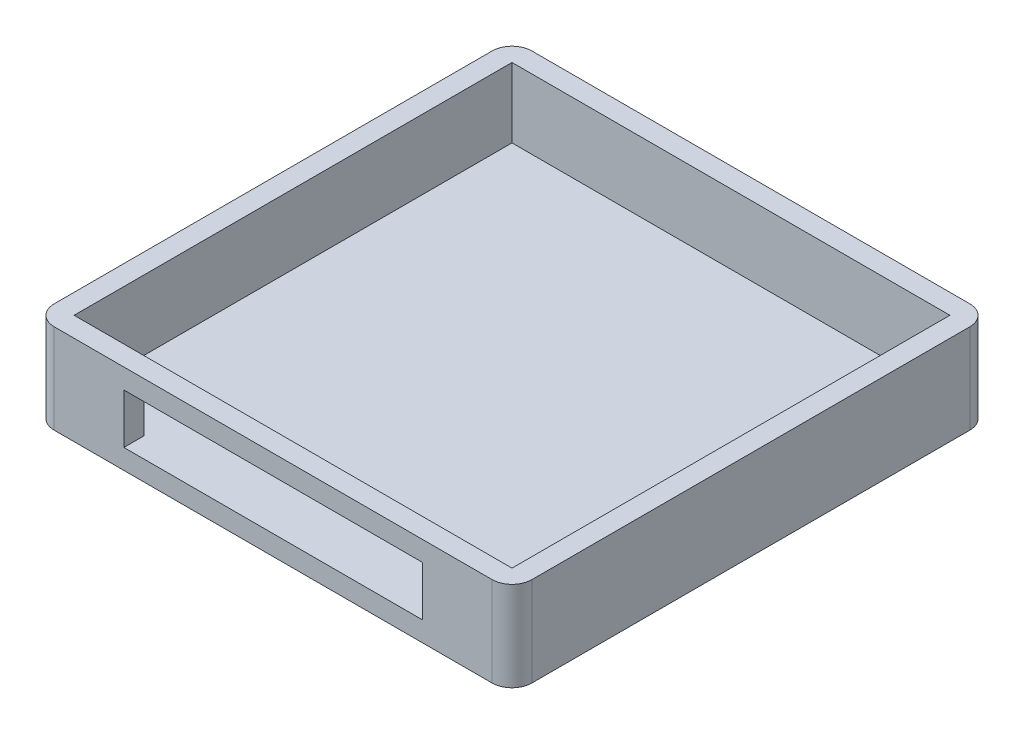
ISO-10303-21;
HEADER;
FILE_DESCRIPTION(('STEP AP214'),'2;1');
FILE_NAME('part.step','',(''),(''),'','','');
FILE_SCHEMA(('AUTOMOTIVE_DESIGN { 1 0 10303 214 1 1 1 1 }'));
ENDSEC;
DATA;
#1=APPLICATION_CONTEXT('core data for automotive mechanical design processes');
#2=APPLICATION_PROTOCOL_DEFINITION('international standard','automotive_design',2000,#1);
#3=PRODUCT_CONTEXT('',#1,'mechanical');
#4=PRODUCT('Part','Part','',(#3));
#5=PRODUCT_RELATED_PRODUCT_CATEGORY('part','',(#4));
#6=PRODUCT_DEFINITION_FORMATION('','',#4);
#7=PRODUCT_DEFINITION_CONTEXT('part definition',#1,'design');
#8=PRODUCT_DEFINITION('design','',#6,#7);
#9=PRODUCT_DEFINITION_SHAPE('','',#8);
#10=(LENGTH_UNIT() NAMED_UNIT(*) SI_UNIT(.MILLI.,.METRE.));
#11=(NAMED_UNIT(*) PLANE_ANGLE_UNIT() SI_UNIT($,.RADIAN.));
#12=(NAMED_UNIT(*) SI_UNIT($,.STERADIAN.) SOLID_ANGLE_UNIT());
#13=UNCERTAINTY_MEASURE_WITH_UNIT(LENGTH_MEASURE(1.E-05),#10,'distance_accuracy_value','');
#14=(GEOMETRIC_REPRESENTATION_CONTEXT(3) GLOBAL_UNCERTAINTY_ASSIGNED_CONTEXT((#13)) GLOBAL_UNIT_ASSIGNED_CONTEXT((#10,
#11,#12)) REPRESENTATION_CONTEXT('',''));
#15=CARTESIAN_POINT('',(0.,0.,0.));
#16=DIRECTION('',(0.,0.,1.));
#17=DIRECTION('',(1.,0.,0.));
#18=AXIS2_PLACEMENT_3D('',#15,#16,#17);
#19=CARTESIAN_POINT('',(24.,9.,-24.));
#20=DIRECTION('',(-1.,0.,0.));
#21=DIRECTION('',(0.,0.,1.));
#22=AXIS2_PLACEMENT_3D('',#19,#20,#21);
#23=PLANE('',#22);
#24=DIRECTION('',(0.,0.,-1.));
#25=VECTOR('',#24,1.);
#26=CARTESIAN_POINT('',(24.,0.,-24.));
#27=LINE('',#26,#25);
#28=CARTESIAN_POINT('',(24.,0.,22.));
#29=VERTEX_POINT('',#28);
#30=CARTESIAN_POINT('',(24.,0.,-22.));
#31=VERTEX_POINT('',#30);
#32=EDGE_CURVE('E225',#29,#31,#27,.T.);
#33=ORIENTED_EDGE('',*,*,#32,.T.);
#34=DIRECTION('',(0.,-1.,0.));
#35=VECTOR('',#34,1.);
#36=CARTESIAN_POINT('',(24.,9.,-22.));
#37=LINE('',#36,#35);
#38=CARTESIAN_POINT('',(24.,9.,-22.));
#39=VERTEX_POINT('',#38);
#40=EDGE_CURVE('E280',#31,#39,#37,.F.);
#41=ORIENTED_EDGE('',*,*,#40,.T.);
#42=DIRECTION('',(0.,0.,-1.));
#43=VECTOR('',#42,1.);
#44=CARTESIAN_POINT('',(24.,9.,-24.));
#45=LINE('',#44,#43);
#46=CARTESIAN_POINT('',(24.,9.,22.));
#47=VERTEX_POINT('',#46);
#48=EDGE_CURVE('E232',#47,#39,#45,.T.);
#49=ORIENTED_EDGE('',*,*,#48,.F.);
#50=DIRECTION('',(0.,-1.,0.));
#51=VECTOR('',#50,1.);
#52=CARTESIAN_POINT('',(24.,9.,22.));
#53=LINE('',#52,#51);
#54=EDGE_CURVE('E277',#47,#29,#53,.T.);
#55=ORIENTED_EDGE('',*,*,#54,.T.);
#56=EDGE_LOOP('',(#33,#41,#49,#55));
#57=FACE_BOUND('',#56,.T.);
#58=ADVANCED_FACE('F33',(#57),#23,.F.);
#59=CARTESIAN_POINT('',(-24.,9.,-24.));
#60=DIRECTION('',(0.,0.,1.));
#61=DIRECTION('',(1.,0.,0.));
#62=AXIS2_PLACEMENT_3D('',#59,#60,#61);
#63=PLANE('',#62);
#64=DIRECTION('',(-1.,0.,0.));
#65=VECTOR('',#64,1.);
#66=CARTESIAN_POINT('',(-24.,0.,-24.));
#67=LINE('',#66,#65);
#68=CARTESIAN_POINT('',(22.,0.,-24.));
#69=VERTEX_POINT('',#68);
#70=CARTESIAN_POINT('',(-22.,0.,-24.));
#71=VERTEX_POINT('',#70);
#72=EDGE_CURVE('E244',#69,#71,#67,.T.);
#73=ORIENTED_EDGE('',*,*,#72,.T.);
#74=DIRECTION('',(0.,-1.,0.));
#75=VECTOR('',#74,1.);
#76=CARTESIAN_POINT('',(-22.,9.,-24.));
#77=LINE('',#76,#75);
#78=CARTESIAN_POINT('',(-22.,9.,-24.));
#79=VERTEX_POINT('',#78);
#80=EDGE_CURVE('E268',#71,#79,#77,.F.);
#81=ORIENTED_EDGE('',*,*,#80,.T.);
#82=DIRECTION('',(-1.,0.,0.));
#83=VECTOR('',#82,1.);
#84=CARTESIAN_POINT('',(-24.,9.,-24.));
#85=LINE('',#84,#83);
#86=CARTESIAN_POINT('',(22.,9.,-24.));
#87=VERTEX_POINT('',#86);
#88=EDGE_CURVE('E235',#87,#79,#85,.T.);
#89=ORIENTED_EDGE('',*,*,#88,.F.);
#90=DIRECTION('',(0.,-1.,0.));
#91=VECTOR('',#90,1.);
#92=CARTESIAN_POINT('',(22.,9.,-24.));
#93=LINE('',#92,#91);
#94=EDGE_CURVE('E265',#87,#69,#93,.T.);
#95=ORIENTED_EDGE('',*,*,#94,.T.);
#96=EDGE_LOOP('',(#73,#81,#89,#95));
#97=FACE_BOUND('',#96,.T.);
#98=ADVANCED_FACE('F295',(#97),#63,.F.);
#99=CARTESIAN_POINT('',(-24.,9.,-24.));
#100=DIRECTION('',(1.,0.,0.));
#101=DIRECTION('',(0.,0.,-1.));
#102=AXIS2_PLACEMENT_3D('',#99,#100,#101);
#103=PLANE('',#102);
#104=DIRECTION('',(0.,0.,1.));
#105=VECTOR('',#104,1.);
#106=CARTESIAN_POINT('',(-24.,9.,-24.));
#107=LINE('',#106,#105);
#108=CARTESIAN_POINT('',(-24.,9.,-22.));
#109=VERTEX_POINT('',#108);
#110=CARTESIAN_POINT('',(-24.,9.,22.));
#111=VERTEX_POINT('',#110);
#112=EDGE_CURVE('E239',#109,#111,#107,.T.);
#113=ORIENTED_EDGE('',*,*,#112,.F.);
#114=DIRECTION('',(0.,-1.,0.));
#115=VECTOR('',#114,1.);
#116=CARTESIAN_POINT('',(-24.,9.,-22.));
#117=LINE('',#116,#115);
#118=CARTESIAN_POINT('',(-24.,0.,-22.));
#119=VERTEX_POINT('',#118);
#120=EDGE_CURVE('E254',#109,#119,#117,.T.);
#121=ORIENTED_EDGE('',*,*,#120,.T.);
#122=DIRECTION('',(0.,0.,1.));
#123=VECTOR('',#122,1.);
#124=CARTESIAN_POINT('',(-24.,0.,-24.));
#125=LINE('',#124,#123);
#126=CARTESIAN_POINT('',(-24.,0.,22.));
#127=VERTEX_POINT('',#126);
#128=EDGE_CURVE('E247',#119,#127,#125,.T.);
#129=ORIENTED_EDGE('',*,*,#128,.T.);
#130=DIRECTION('',(0.,-1.,0.));
#131=VECTOR('',#130,1.);
#132=CARTESIAN_POINT('',(-24.,9.,22.));
#133=LINE('',#132,#131);
#134=EDGE_CURVE('E252',#127,#111,#133,.F.);
#135=ORIENTED_EDGE('',*,*,#134,.T.);
#136=EDGE_LOOP('',(#113,#121,#129,#135));
#137=FACE_BOUND('',#136,.T.);
#138=ADVANCED_FACE('F306',(#137),#103,.F.);
#139=CARTESIAN_POINT('',(-24.,9.,24.));
#140=DIRECTION('',(0.,0.,-1.));
#141=DIRECTION('',(-1.,0.,0.));
#142=AXIS2_PLACEMENT_3D('',#139,#140,#141);
#143=PLANE('',#142);
#144=DIRECTION('',(-1.,0.,0.));
#145=VECTOR('',#144,1.);
#146=CARTESIAN_POINT('',(-15.,7.,24.));
#147=LINE('',#146,#145);
#148=CARTESIAN_POINT('',(15.,7.,24.));
#149=VERTEX_POINT('',#148);
#150=CARTESIAN_POINT('',(-15.,7.,24.));
#151=VERTEX_POINT('',#150);
#152=EDGE_CURVE('E162',#149,#151,#147,.T.);
#153=ORIENTED_EDGE('',*,*,#152,.F.);
#154=DIRECTION('',(0.,1.,0.));
#155=VECTOR('',#154,1.);
#156=CARTESIAN_POINT('',(15.,7.,24.));
#157=LINE('',#156,#155);
#158=CARTESIAN_POINT('',(15.,2.,24.));
#159=VERTEX_POINT('',#158);
#160=EDGE_CURVE('E167',#159,#149,#157,.T.);
#161=ORIENTED_EDGE('',*,*,#160,.F.);
#162=DIRECTION('',(1.,0.,0.));
#163=VECTOR('',#162,1.);
#164=CARTESIAN_POINT('',(-15.,2.,24.));
#165=LINE('',#164,#163);
#166=CARTESIAN_POINT('',(-15.,2.,24.));
#167=VERTEX_POINT('',#166);
#168=EDGE_CURVE('E171',#167,#159,#165,.T.);
#169=ORIENTED_EDGE('',*,*,#168,.F.);
#170=DIRECTION('',(0.,-1.,0.));
#171=VECTOR('',#170,1.);
#172=CARTESIAN_POINT('',(-15.,7.,24.));
#173=LINE('',#172,#171);
#174=EDGE_CURVE('E151',#151,#167,#173,.T.);
#175=ORIENTED_EDGE('',*,*,#174,.F.);
#176=EDGE_LOOP('',(#153,#161,#169,#175));
#177=FACE_BOUND('',#176,.T.);
#178=DIRECTION('',(1.,0.,0.));
#179=VECTOR('',#178,1.);
#180=CARTESIAN_POINT('',(-24.,9.,24.));
#181=LINE('',#180,#179);
#182=CARTESIAN_POINT('',(-22.,9.,24.));
#183=VERTEX_POINT('',#182);
#184=CARTESIAN_POINT('',(22.,9.,24.));
#185=VERTEX_POINT('',#184);
#186=EDGE_CURVE('E198',#183,#185,#181,.T.);
#187=ORIENTED_EDGE('',*,*,#186,.F.);
#188=DIRECTION('',(0.,-1.,0.));
#189=VECTOR('',#188,1.);
#190=CARTESIAN_POINT('',(-22.,9.,24.));
#191=LINE('',#190,#189);
#192=CARTESIAN_POINT('',(-22.,0.,24.));
#193=VERTEX_POINT('',#192);
#194=EDGE_CURVE('E11',#183,#193,#191,.T.);
#195=ORIENTED_EDGE('',*,*,#194,.T.);
#196=DIRECTION('',(1.,0.,0.));
#197=VECTOR('',#196,1.);
#198=CARTESIAN_POINT('',(-24.,0.,24.));
#199=LINE('',#198,#197);
#200=CARTESIAN_POINT('',(22.,0.,24.));
#201=VERTEX_POINT('',#200);
#202=EDGE_CURVE('E236',#193,#201,#199,.T.);
#203=ORIENTED_EDGE('',*,*,#202,.T.);
#204=DIRECTION('',(0.,-1.,0.));
#205=VECTOR('',#204,1.);
#206=CARTESIAN_POINT('',(22.,9.,24.));
#207=LINE('',#206,#205);
#208=EDGE_CURVE('E41',#201,#185,#207,.F.);
#209=ORIENTED_EDGE('',*,*,#208,.T.);
#210=EDGE_LOOP('',(#187,#195,#203,#209));
#211=FACE_BOUND('',#210,.T.);
#212=ADVANCED_FACE('F169',(#177,#211),#143,.F.);
#213=CARTESIAN_POINT('',(0.,9.,0.));
#214=DIRECTION('',(0.,1.,0.));
#215=DIRECTION('',(0.,0.,1.));
#216=AXIS2_PLACEMENT_3D('',#213,#214,#215);
#217=PLANE('',#216);
#218=DIRECTION('',(0.,0.,-1.));
#219=VECTOR('',#218,1.);
#220=CARTESIAN_POINT('',(22.,9.,-22.));
#221=LINE('',#220,#219);
#222=CARTESIAN_POINT('',(22.,9.,22.));
#223=VERTEX_POINT('',#222);
#224=CARTESIAN_POINT('',(22.,9.,-22.));
#225=VERTEX_POINT('',#224);
#226=EDGE_CURVE('E193',#223,#225,#221,.T.);
#227=ORIENTED_EDGE('',*,*,#226,.F.);
#228=DIRECTION('',(1.,0.,0.));
#229=VECTOR('',#228,1.);
#230=CARTESIAN_POINT('',(-22.,9.,22.));
#231=LINE('',#230,#229);
#232=CARTESIAN_POINT('',(-22.,9.,22.));
#233=VERTEX_POINT('',#232);
#234=EDGE_CURVE('E203',#233,#223,#231,.T.);
#235=ORIENTED_EDGE('',*,*,#234,.F.);
#236=DIRECTION('',(0.,0.,1.));
#237=VECTOR('',#236,1.);
#238=CARTESIAN_POINT('',(-22.,9.,-22.));
#239=LINE('',#238,#237);
#240=CARTESIAN_POINT('',(-22.,9.,-22.));
#241=VERTEX_POINT('',#240);
#242=EDGE_CURVE('E218',#241,#233,#239,.T.);
#243=ORIENTED_EDGE('',*,*,#242,.F.);
#244=DIRECTION('',(-1.,0.,0.));
#245=VECTOR('',#244,1.);
#246=CARTESIAN_POINT('',(-22.,9.,-22.));
#247=LINE('',#246,#245);
#248=EDGE_CURVE('E215',#225,#241,#247,.T.);
#249=ORIENTED_EDGE('',*,*,#248,.F.);
#250=EDGE_LOOP('',(#227,#235,#243,#249));
#251=FACE_BOUND('',#250,.T.);
#252=ORIENTED_EDGE('',*,*,#88,.T.);
#253=CARTESIAN_POINT('',(-22.,9.,-22.));
#254=DIRECTION('',(0.,1.,0.));
#255=DIRECTION('',(0.,0.,1.));
#256=AXIS2_PLACEMENT_3D('',#253,#254,#255);
#257=CIRCLE('',#256,2.);
#258=EDGE_CURVE('E275',#79,#109,#257,.T.);
#259=ORIENTED_EDGE('',*,*,#258,.T.);
#260=ORIENTED_EDGE('',*,*,#112,.T.);
#261=CARTESIAN_POINT('',(-22.,9.,22.));
#262=DIRECTION('',(0.,1.,0.));
#263=DIRECTION('',(0.,0.,1.));
#264=AXIS2_PLACEMENT_3D('',#261,#262,#263);
#265=CIRCLE('',#264,2.);
#266=EDGE_CURVE('E54',#111,#183,#265,.T.);
#267=ORIENTED_EDGE('',*,*,#266,.T.);
#268=ORIENTED_EDGE('',*,*,#186,.T.);
#269=CARTESIAN_POINT('',(22.,9.,22.));
#270=DIRECTION('',(0.,1.,0.));
#271=DIRECTION('',(0.,0.,1.));
#272=AXIS2_PLACEMENT_3D('',#269,#270,#271);
#273=CIRCLE('',#272,2.);
#274=EDGE_CURVE('E270',#185,#47,#273,.T.);
#275=ORIENTED_EDGE('',*,*,#274,.T.);
#276=ORIENTED_EDGE('',*,*,#48,.T.);
#277=CARTESIAN_POINT('',(22.,9.,-22.));
#278=DIRECTION('',(0.,1.,0.));
#279=DIRECTION('',(0.,0.,1.));
#280=AXIS2_PLACEMENT_3D('',#277,#278,#279);
#281=CIRCLE('',#280,2.);
#282=EDGE_CURVE('E273',#39,#87,#281,.T.);
#283=ORIENTED_EDGE('',*,*,#282,.T.);
#284=EDGE_LOOP('',(#252,#259,#260,#267,#268,#275,#276,#283));
#285=FACE_BOUND('',#284,.T.);
#286=ADVANCED_FACE('F288',(#251,#285),#217,.T.);
#287=CARTESIAN_POINT('',(0.,0.,0.));
#288=DIRECTION('',(0.,1.,0.));
#289=DIRECTION('',(0.,0.,1.));
#290=AXIS2_PLACEMENT_3D('',#287,#288,#289);
#291=PLANE('',#290);
#292=CARTESIAN_POINT('',(0.,0.,0.));
#293=DIRECTION('',(0.,-1.,0.));
#294=DIRECTION('',(0.,0.,-1.));
#295=AXIS2_PLACEMENT_3D('',#292,#293,#294);
#296=CIRCLE('',#295,6.);
#297=CARTESIAN_POINT('',(0.,0.,-6.));
#298=VERTEX_POINT('',#297);
#299=EDGE_CURVE('E194',#298,#298,#296,.T.);
#300=ORIENTED_EDGE('',*,*,#299,.F.);
#301=EDGE_LOOP('',(#300));
#302=FACE_BOUND('',#301,.T.);
#303=ORIENTED_EDGE('',*,*,#128,.F.);
#304=CARTESIAN_POINT('',(-22.,0.,-22.));
#305=DIRECTION('',(0.,1.,0.));
#306=DIRECTION('',(0.,0.,1.));
#307=AXIS2_PLACEMENT_3D('',#304,#305,#306);
#308=CIRCLE('',#307,2.);
#309=EDGE_CURVE('E263',#119,#71,#308,.F.);
#310=ORIENTED_EDGE('',*,*,#309,.T.);
#311=ORIENTED_EDGE('',*,*,#72,.F.);
#312=CARTESIAN_POINT('',(22.,0.,-22.));
#313=DIRECTION('',(0.,1.,0.));
#314=DIRECTION('',(0.,0.,1.));
#315=AXIS2_PLACEMENT_3D('',#312,#313,#314);
#316=CIRCLE('',#315,2.);
#317=EDGE_CURVE('E261',#69,#31,#316,.F.);
#318=ORIENTED_EDGE('',*,*,#317,.T.);
#319=ORIENTED_EDGE('',*,*,#32,.F.);
#320=CARTESIAN_POINT('',(22.,0.,22.));
#321=DIRECTION('',(0.,1.,0.));
#322=DIRECTION('',(0.,0.,1.));
#323=AXIS2_PLACEMENT_3D('',#320,#321,#322);
#324=CIRCLE('',#323,2.);
#325=EDGE_CURVE('E257',#29,#201,#324,.F.);
#326=ORIENTED_EDGE('',*,*,#325,.T.);
#327=ORIENTED_EDGE('',*,*,#202,.F.);
#328=CARTESIAN_POINT('',(-22.,0.,22.));
#329=DIRECTION('',(0.,1.,0.));
#330=DIRECTION('',(0.,0.,1.));
#331=AXIS2_PLACEMENT_3D('',#328,#329,#330);
#332=CIRCLE('',#331,2.);
#333=EDGE_CURVE('E259',#193,#127,#332,.F.);
#334=ORIENTED_EDGE('',*,*,#333,.T.);
#335=EDGE_LOOP('',(#303,#310,#311,#318,#319,#326,#327,#334));
#336=FACE_BOUND('',#335,.T.);
#337=ADVANCED_FACE('F299',(#302,#336),#291,.F.);
#338=CARTESIAN_POINT('',(22.,2.,-22.));
#339=DIRECTION('',(1.,0.,0.));
#340=DIRECTION('',(0.,0.,-1.));
#341=AXIS2_PLACEMENT_3D('',#338,#339,#340);
#342=PLANE('',#341);
#343=ORIENTED_EDGE('',*,*,#226,.T.);
#344=DIRECTION('',(0.,1.,0.));
#345=VECTOR('',#344,1.);
#346=CARTESIAN_POINT('',(22.,2.,-22.));
#347=LINE('',#346,#345);
#348=CARTESIAN_POINT('',(22.,2.,-22.));
#349=VERTEX_POINT('',#348);
#350=EDGE_CURVE('E213',#349,#225,#347,.T.);
#351=ORIENTED_EDGE('',*,*,#350,.F.);
#352=DIRECTION('',(0.,0.,-1.));
#353=VECTOR('',#352,1.);
#354=CARTESIAN_POINT('',(22.,2.,-22.));
#355=LINE('',#354,#353);
#356=CARTESIAN_POINT('',(22.,2.,22.));
#357=VERTEX_POINT('',#356);
#358=EDGE_CURVE('E199',#357,#349,#355,.T.);
#359=ORIENTED_EDGE('',*,*,#358,.F.);
#360=DIRECTION('',(0.,1.,0.));
#361=VECTOR('',#360,1.);
#362=CARTESIAN_POINT('',(22.,2.,22.));
#363=LINE('',#362,#361);
#364=EDGE_CURVE('E223',#357,#223,#363,.T.);
#365=ORIENTED_EDGE('',*,*,#364,.T.);
#366=EDGE_LOOP('',(#343,#351,#359,#365));
#367=FACE_BOUND('',#366,.T.);
#368=ADVANCED_FACE('F448',(#367),#342,.F.);
#369=CARTESIAN_POINT('',(-22.,2.,22.));
#370=DIRECTION('',(0.,0.,1.));
#371=DIRECTION('',(1.,0.,0.));
#372=AXIS2_PLACEMENT_3D('',#369,#370,#371);
#373=PLANE('',#372);
#374=DIRECTION('',(1.,0.,0.));
#375=VECTOR('',#374,1.);
#376=CARTESIAN_POINT('',(-22.,2.,22.));
#377=LINE('',#376,#375);
#378=CARTESIAN_POINT('',(15.,2.,22.));
#379=VERTEX_POINT('',#378);
#380=EDGE_CURVE('E209',#379,#357,#377,.T.);
#381=ORIENTED_EDGE('',*,*,#380,.F.);
#382=DIRECTION('',(0.,1.,0.));
#383=VECTOR('',#382,1.);
#384=CARTESIAN_POINT('',(15.,2.,22.));
#385=LINE('',#384,#383);
#386=CARTESIAN_POINT('',(15.,7.,22.));
#387=VERTEX_POINT('',#386);
#388=EDGE_CURVE('E181',#379,#387,#385,.T.);
#389=ORIENTED_EDGE('',*,*,#388,.T.);
#390=DIRECTION('',(-1.,0.,0.));
#391=VECTOR('',#390,1.);
#392=CARTESIAN_POINT('',(-22.,7.,22.));
#393=LINE('',#392,#391);
#394=CARTESIAN_POINT('',(-15.,7.,22.));
#395=VERTEX_POINT('',#394);
#396=EDGE_CURVE('E197',#387,#395,#393,.T.);
#397=ORIENTED_EDGE('',*,*,#396,.T.);
#398=DIRECTION('',(0.,-1.,0.));
#399=VECTOR('',#398,1.);
#400=CARTESIAN_POINT('',(-15.,2.,22.));
#401=LINE('',#400,#399);
#402=CARTESIAN_POINT('',(-15.,2.,22.));
#403=VERTEX_POINT('',#402);
#404=EDGE_CURVE('E154',#395,#403,#401,.T.);
#405=ORIENTED_EDGE('',*,*,#404,.T.);
#406=CARTESIAN_POINT('',(-22.,2.,22.));
#407=VERTEX_POINT('',#406);
#408=EDGE_CURVE('E210',#407,#403,#377,.T.);
#409=ORIENTED_EDGE('',*,*,#408,.F.);
#410=DIRECTION('',(0.,1.,0.));
#411=VECTOR('',#410,1.);
#412=CARTESIAN_POINT('',(-22.,2.,22.));
#413=LINE('',#412,#411);
#414=EDGE_CURVE('E226',#407,#233,#413,.T.);
#415=ORIENTED_EDGE('',*,*,#414,.T.);
#416=ORIENTED_EDGE('',*,*,#234,.T.);
#417=ORIENTED_EDGE('',*,*,#364,.F.);
#418=EDGE_LOOP('',(#381,#389,#397,#405,#409,#415,#416,#417));
#419=FACE_BOUND('',#418,.T.);
#420=ADVANCED_FACE('F440',(#419),#373,.F.);
#421=CARTESIAN_POINT('',(-22.,2.,-22.));
#422=DIRECTION('',(-1.,0.,0.));
#423=DIRECTION('',(0.,0.,1.));
#424=AXIS2_PLACEMENT_3D('',#421,#422,#423);
#425=PLANE('',#424);
#426=ORIENTED_EDGE('',*,*,#242,.T.);
#427=ORIENTED_EDGE('',*,*,#414,.F.);
#428=DIRECTION('',(0.,0.,1.));
#429=VECTOR('',#428,1.);
#430=CARTESIAN_POINT('',(-22.,2.,-22.));
#431=LINE('',#430,#429);
#432=CARTESIAN_POINT('',(-22.,2.,-22.));
#433=VERTEX_POINT('',#432);
#434=EDGE_CURVE('E206',#433,#407,#431,.T.);
#435=ORIENTED_EDGE('',*,*,#434,.F.);
#436=DIRECTION('',(0.,1.,0.));
#437=VECTOR('',#436,1.);
#438=CARTESIAN_POINT('',(-22.,2.,-22.));
#439=LINE('',#438,#437);
#440=EDGE_CURVE('E228',#433,#241,#439,.T.);
#441=ORIENTED_EDGE('',*,*,#440,.T.);
#442=EDGE_LOOP('',(#426,#427,#435,#441));
#443=FACE_BOUND('',#442,.T.);
#444=ADVANCED_FACE('F430',(#443),#425,.F.);
#445=CARTESIAN_POINT('',(-22.,2.,-22.));
#446=DIRECTION('',(0.,0.,-1.));
#447=DIRECTION('',(-1.,0.,0.));
#448=AXIS2_PLACEMENT_3D('',#445,#446,#447);
#449=PLANE('',#448);
#450=ORIENTED_EDGE('',*,*,#248,.T.);
#451=ORIENTED_EDGE('',*,*,#440,.F.);
#452=DIRECTION('',(-1.,0.,0.));
#453=VECTOR('',#452,1.);
#454=CARTESIAN_POINT('',(-22.,2.,-22.));
#455=LINE('',#454,#453);
#456=EDGE_CURVE('E202',#349,#433,#455,.T.);
#457=ORIENTED_EDGE('',*,*,#456,.F.);
#458=ORIENTED_EDGE('',*,*,#350,.T.);
#459=EDGE_LOOP('',(#450,#451,#457,#458));
#460=FACE_BOUND('',#459,.T.);
#461=ADVANCED_FACE('F384',(#460),#449,.F.);
#462=CARTESIAN_POINT('',(0.,2.,0.));
#463=DIRECTION('',(0.,1.,0.));
#464=DIRECTION('',(0.,0.,1.));
#465=AXIS2_PLACEMENT_3D('',#462,#463,#464);
#466=PLANE('',#465);
#467=ORIENTED_EDGE('',*,*,#408,.T.);
#468=DIRECTION('',(0.,0.,1.));
#469=VECTOR('',#468,1.);
#470=CARTESIAN_POINT('',(-15.,2.,14.));
#471=LINE('',#470,#469);
#472=EDGE_CURVE('E157',#403,#167,#471,.T.);
#473=ORIENTED_EDGE('',*,*,#472,.T.);
#474=ORIENTED_EDGE('',*,*,#168,.T.);
#475=DIRECTION('',(0.,0.,1.));
#476=VECTOR('',#475,1.);
#477=CARTESIAN_POINT('',(15.,2.,14.));
#478=LINE('',#477,#476);
#479=EDGE_CURVE('E176',#379,#159,#478,.T.);
#480=ORIENTED_EDGE('',*,*,#479,.F.);
#481=ORIENTED_EDGE('',*,*,#380,.T.);
#482=ORIENTED_EDGE('',*,*,#358,.T.);
#483=ORIENTED_EDGE('',*,*,#456,.T.);
#484=ORIENTED_EDGE('',*,*,#434,.T.);
#485=EDGE_LOOP('',(#467,#473,#474,#480,#481,#482,#483,#484));
#486=FACE_BOUND('',#485,.T.);
#487=ADVANCED_FACE('F377',(#486),#466,.T.);
#488=CARTESIAN_POINT('',(0.,-10.,0.));
#489=DIRECTION('',(0.,1.,0.));
#490=DIRECTION('',(0.,0.,1.));
#491=AXIS2_PLACEMENT_3D('',#488,#489,#490);
#492=CYLINDRICAL_SURFACE('',#491,6.);
#493=CARTESIAN_POINT('',(0.,-10.,0.));
#494=DIRECTION('',(0.,-1.,0.));
#495=DIRECTION('',(0.,0.,-1.));
#496=AXIS2_PLACEMENT_3D('',#493,#494,#495);
#497=CIRCLE('',#496,6.);
#498=CARTESIAN_POINT('',(0.,-10.,-6.));
#499=VERTEX_POINT('',#498);
#500=EDGE_CURVE('E190',#499,#499,#497,.T.);
#501=ORIENTED_EDGE('',*,*,#500,.F.);
#502=EDGE_LOOP('',(#501));
#503=FACE_BOUND('',#502,.T.);
#504=ORIENTED_EDGE('',*,*,#299,.T.);
#505=EDGE_LOOP('',(#504));
#506=FACE_BOUND('',#505,.T.);
#507=ADVANCED_FACE('F383',(#503,#506),#492,.T.);
#508=CARTESIAN_POINT('',(0.,-10.,0.));
#509=DIRECTION('',(0.,-1.,0.));
#510=DIRECTION('',(0.,0.,-1.));
#511=AXIS2_PLACEMENT_3D('',#508,#509,#510);
#512=PLANE('',#511);
#513=CARTESIAN_POINT('',(0.,-10.,0.));
#514=DIRECTION('',(0.,-1.,0.));
#515=DIRECTION('',(0.,0.,-1.));
#516=AXIS2_PLACEMENT_3D('',#513,#514,#515);
#517=CIRCLE('',#516,3.6);
#518=CARTESIAN_POINT('',(0.,-10.,-3.6));
#519=VERTEX_POINT('',#518);
#520=EDGE_CURVE('E184',#519,#519,#517,.T.);
#521=ORIENTED_EDGE('',*,*,#520,.F.);
#522=EDGE_LOOP('',(#521));
#523=FACE_BOUND('',#522,.T.);
#524=ORIENTED_EDGE('',*,*,#500,.T.);
#525=EDGE_LOOP('',(#524));
#526=FACE_BOUND('',#525,.T.);
#527=ADVANCED_FACE('F407',(#523,#526),#512,.T.);
#528=CARTESIAN_POINT('',(0.,0.,0.));
#529=DIRECTION('',(0.,1.,0.));
#530=DIRECTION('',(0.,0.,1.));
#531=AXIS2_PLACEMENT_3D('',#528,#529,#530);
#532=PLANE('',#531);
#533=CARTESIAN_POINT('',(0.,0.,0.));
#534=DIRECTION('',(0.,1.,0.));
#535=DIRECTION('',(0.,0.,1.));
#536=AXIS2_PLACEMENT_3D('',#533,#534,#535);
#537=CIRCLE('',#536,3.6);
#538=CARTESIAN_POINT('',(0.,0.,3.6));
#539=VERTEX_POINT('',#538);
#540=EDGE_CURVE('E187',#539,#539,#537,.F.);
#541=ORIENTED_EDGE('',*,*,#540,.T.);
#542=EDGE_LOOP('',(#541));
#543=FACE_BOUND('',#542,.T.);
#544=ADVANCED_FACE('F398',(#543),#532,.F.);
#545=CARTESIAN_POINT('',(0.,10.1823376490863,0.));
#546=DIRECTION('',(0.,-1.,0.));
#547=DIRECTION('',(0.,0.,-1.));
#548=AXIS2_PLACEMENT_3D('',#545,#546,#547);
#549=CYLINDRICAL_SURFACE('',#548,3.6);
#550=ORIENTED_EDGE('',*,*,#520,.T.);
#551=EDGE_LOOP('',(#550));
#552=FACE_BOUND('',#551,.T.);
#553=ORIENTED_EDGE('',*,*,#540,.F.);
#554=EDGE_LOOP('',(#553));
#555=FACE_BOUND('',#554,.T.);
#556=ADVANCED_FACE('F373',(#552,#555),#549,.F.);
#557=CARTESIAN_POINT('',(-15.,7.,14.));
#558=DIRECTION('',(0.,1.,0.));
#559=DIRECTION('',(0.,0.,1.));
#560=AXIS2_PLACEMENT_3D('',#557,#558,#559);
#561=PLANE('',#560);
#562=DIRECTION('',(0.,0.,1.));
#563=VECTOR('',#562,1.);
#564=CARTESIAN_POINT('',(15.,7.,14.));
#565=LINE('',#564,#563);
#566=EDGE_CURVE('E158',#387,#149,#565,.T.);
#567=ORIENTED_EDGE('',*,*,#566,.T.);
#568=ORIENTED_EDGE('',*,*,#152,.T.);
#569=DIRECTION('',(0.,0.,1.));
#570=VECTOR('',#569,1.);
#571=CARTESIAN_POINT('',(-15.,7.,14.));
#572=LINE('',#571,#570);
#573=EDGE_CURVE('E147',#395,#151,#572,.T.);
#574=ORIENTED_EDGE('',*,*,#573,.F.);
#575=ORIENTED_EDGE('',*,*,#396,.F.);
#576=EDGE_LOOP('',(#567,#568,#574,#575));
#577=FACE_BOUND('',#576,.T.);
#578=ADVANCED_FACE('F163',(#577),#561,.F.);
#579=CARTESIAN_POINT('',(15.,7.,14.));
#580=DIRECTION('',(1.,0.,0.));
#581=DIRECTION('',(0.,0.,-1.));
#582=AXIS2_PLACEMENT_3D('',#579,#580,#581);
#583=PLANE('',#582);
#584=ORIENTED_EDGE('',*,*,#479,.T.);
#585=ORIENTED_EDGE('',*,*,#160,.T.);
#586=ORIENTED_EDGE('',*,*,#566,.F.);
#587=ORIENTED_EDGE('',*,*,#388,.F.);
#588=EDGE_LOOP('',(#584,#585,#586,#587));
#589=FACE_BOUND('',#588,.T.);
#590=ADVANCED_FACE('F357',(#589),#583,.F.);
#591=CARTESIAN_POINT('',(-15.,7.,14.));
#592=DIRECTION('',(-1.,0.,0.));
#593=DIRECTION('',(0.,0.,1.));
#594=AXIS2_PLACEMENT_3D('',#591,#592,#593);
#595=PLANE('',#594);
#596=ORIENTED_EDGE('',*,*,#573,.T.);
#597=ORIENTED_EDGE('',*,*,#174,.T.);
#598=ORIENTED_EDGE('',*,*,#472,.F.);
#599=ORIENTED_EDGE('',*,*,#404,.F.);
#600=EDGE_LOOP('',(#596,#597,#598,#599));
#601=FACE_BOUND('',#600,.T.);
#602=ADVANCED_FACE('F149',(#601),#595,.F.);
#603=CARTESIAN_POINT('',(-22.,9.,-22.));
#604=DIRECTION('',(0.,-1.,0.));
#605=DIRECTION('',(0.,0.,-1.));
#606=AXIS2_PLACEMENT_3D('',#603,#604,#605);
#607=CYLINDRICAL_SURFACE('',#606,2.);
#608=ORIENTED_EDGE('',*,*,#258,.F.);
#609=ORIENTED_EDGE('',*,*,#80,.F.);
#610=ORIENTED_EDGE('',*,*,#309,.F.);
#611=ORIENTED_EDGE('',*,*,#120,.F.);
#612=EDGE_LOOP('',(#608,#609,#610,#611));
#613=FACE_BOUND('',#612,.T.);
#614=ADVANCED_FACE('F303',(#613),#607,.T.);
#615=CARTESIAN_POINT('',(22.,9.,-22.));
#616=DIRECTION('',(0.,-1.,0.));
#617=DIRECTION('',(0.,0.,-1.));
#618=AXIS2_PLACEMENT_3D('',#615,#616,#617);
#619=CYLINDRICAL_SURFACE('',#618,2.);
#620=ORIENTED_EDGE('',*,*,#282,.F.);
#621=ORIENTED_EDGE('',*,*,#40,.F.);
#622=ORIENTED_EDGE('',*,*,#317,.F.);
#623=ORIENTED_EDGE('',*,*,#94,.F.);
#624=EDGE_LOOP('',(#620,#621,#622,#623));
#625=FACE_BOUND('',#624,.T.);
#626=ADVANCED_FACE('F292',(#625),#619,.T.);
#627=CARTESIAN_POINT('',(-22.,9.,22.));
#628=DIRECTION('',(0.,-1.,0.));
#629=DIRECTION('',(0.,0.,-1.));
#630=AXIS2_PLACEMENT_3D('',#627,#628,#629);
#631=CYLINDRICAL_SURFACE('',#630,2.);
#632=ORIENTED_EDGE('',*,*,#266,.F.);
#633=ORIENTED_EDGE('',*,*,#134,.F.);
#634=ORIENTED_EDGE('',*,*,#333,.F.);
#635=ORIENTED_EDGE('',*,*,#194,.F.);
#636=EDGE_LOOP('',(#632,#633,#634,#635));
#637=FACE_BOUND('',#636,.T.);
#638=ADVANCED_FACE('F310',(#637),#631,.T.);
#639=CARTESIAN_POINT('',(22.,9.,22.));
#640=DIRECTION('',(0.,-1.,0.));
#641=DIRECTION('',(0.,0.,-1.));
#642=AXIS2_PLACEMENT_3D('',#639,#640,#641);
#643=CYLINDRICAL_SURFACE('',#642,2.);
#644=ORIENTED_EDGE('',*,*,#274,.F.);
#645=ORIENTED_EDGE('',*,*,#208,.F.);
#646=ORIENTED_EDGE('',*,*,#325,.F.);
#647=ORIENTED_EDGE('',*,*,#54,.F.);
#648=EDGE_LOOP('',(#644,#645,#646,#647));
#649=FACE_BOUND('',#648,.T.);
#650=ADVANCED_FACE('F35',(#649),#643,.T.);
#651=CLOSED_SHELL('',(#58,#98,#138,#212,#286,#337,#368,#420,#444,#461,#487,#507,#527,#544,#556,
#578,#590,#602,#614,#626,#638,#650));
#652=MANIFOLD_SOLID_BREP('B2',#651);
#653=ADVANCED_BREP_SHAPE_REPRESENTATION('',(#18,#652),#14);
#654=SHAPE_DEFINITION_REPRESENTATION(#9,#653);
ENDSEC;
END-ISO-10303-21;
